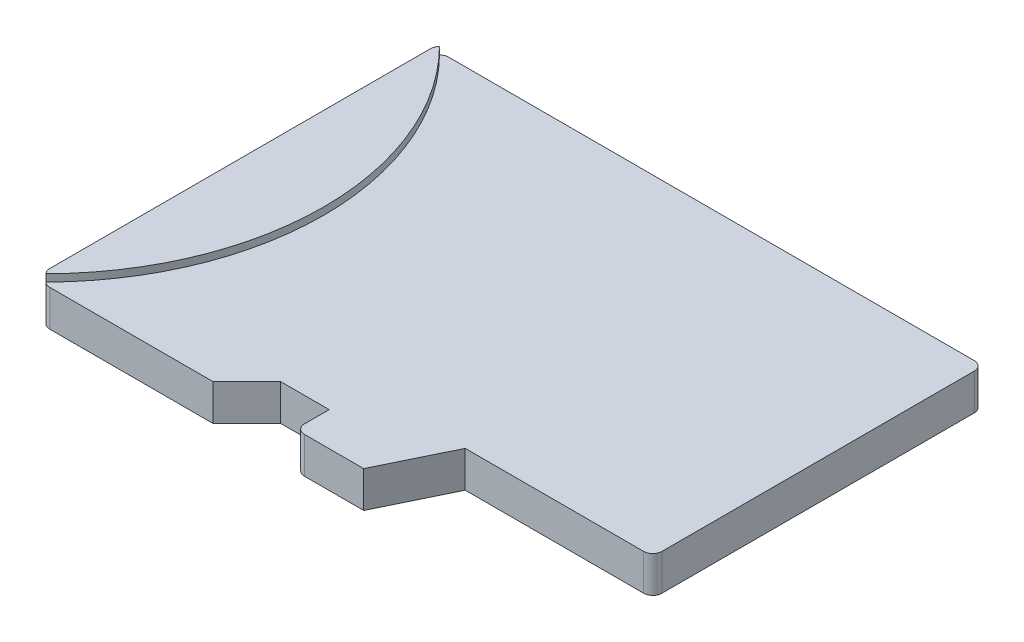
ISO-10303-21;
HEADER;
FILE_DESCRIPTION(('STEP AP214'),'2;1');
FILE_NAME('part.step','',(''),(''),'','','');
FILE_SCHEMA(('AUTOMOTIVE_DESIGN { 1 0 10303 214 1 1 1 1 }'));
ENDSEC;
DATA;
#1=APPLICATION_CONTEXT('core data for automotive mechanical design processes');
#2=APPLICATION_PROTOCOL_DEFINITION('international standard','automotive_design',2000,#1);
#3=PRODUCT_CONTEXT('',#1,'mechanical');
#4=PRODUCT('Part','Part','',(#3));
#5=PRODUCT_RELATED_PRODUCT_CATEGORY('part','',(#4));
#6=PRODUCT_DEFINITION_FORMATION('','',#4);
#7=PRODUCT_DEFINITION_CONTEXT('part definition',#1,'design');
#8=PRODUCT_DEFINITION('design','',#6,#7);
#9=PRODUCT_DEFINITION_SHAPE('','',#8);
#10=(LENGTH_UNIT() NAMED_UNIT(*) SI_UNIT(.MILLI.,.METRE.));
#11=(NAMED_UNIT(*) PLANE_ANGLE_UNIT() SI_UNIT($,.RADIAN.));
#12=(NAMED_UNIT(*) SI_UNIT($,.STERADIAN.) SOLID_ANGLE_UNIT());
#13=UNCERTAINTY_MEASURE_WITH_UNIT(LENGTH_MEASURE(1.E-05),#10,'distance_accuracy_value','');
#14=(GEOMETRIC_REPRESENTATION_CONTEXT(3) GLOBAL_UNCERTAINTY_ASSIGNED_CONTEXT((#13)) GLOBAL_UNIT_ASSIGNED_CONTEXT((#10,
#11,#12)) REPRESENTATION_CONTEXT('',''));
#15=CARTESIAN_POINT('',(0.,0.,0.));
#16=DIRECTION('',(0.,0.,1.));
#17=DIRECTION('',(1.,0.,0.));
#18=AXIS2_PLACEMENT_3D('',#15,#16,#17);
#19=CARTESIAN_POINT('',(0.,1.,0.));
#20=DIRECTION('',(0.,0.,-1.));
#21=DIRECTION('',(-1.,0.,0.));
#22=AXIS2_PLACEMENT_3D('',#19,#20,#21);
#23=PLANE('',#22);
#24=DIRECTION('',(1.,0.,0.));
#25=VECTOR('',#24,1.);
#26=CARTESIAN_POINT('',(0.,1.,0.));
#27=LINE('',#26,#25);
#28=CARTESIAN_POINT('',(0.25,1.,0.));
#29=VERTEX_POINT('',#28);
#30=CARTESIAN_POINT('',(4.74943820224719,1.,0.));
#31=VERTEX_POINT('',#30);
#32=EDGE_CURVE('E236',#29,#31,#27,.T.);
#33=ORIENTED_EDGE('',*,*,#32,.F.);
#34=DIRECTION('',(0.,-1.,0.));
#35=VECTOR('',#34,1.);
#36=CARTESIAN_POINT('',(0.25,1.,0.));
#37=LINE('',#36,#35);
#38=CARTESIAN_POINT('',(0.25,0.,0.));
#39=VERTEX_POINT('',#38);
#40=EDGE_CURVE('E317',#29,#39,#37,.T.);
#41=ORIENTED_EDGE('',*,*,#40,.T.);
#42=DIRECTION('',(1.,0.,0.));
#43=VECTOR('',#42,1.);
#44=CARTESIAN_POINT('',(0.,0.,0.));
#45=LINE('',#44,#43);
#46=CARTESIAN_POINT('',(4.74943820224719,0.,0.));
#47=VERTEX_POINT('',#46);
#48=EDGE_CURVE('E170',#39,#47,#45,.T.);
#49=ORIENTED_EDGE('',*,*,#48,.T.);
#50=DIRECTION('',(0.,1.,0.));
#51=VECTOR('',#50,1.);
#52=CARTESIAN_POINT('',(4.74943820224719,0.,0.));
#53=LINE('',#52,#51);
#54=EDGE_CURVE('E226',#47,#31,#53,.T.);
#55=ORIENTED_EDGE('',*,*,#54,.T.);
#56=EDGE_LOOP('',(#33,#41,#49,#55));
#57=FACE_BOUND('',#56,.T.);
#58=ADVANCED_FACE('F39',(#57),#23,.F.);
#59=CARTESIAN_POINT('',(0.,1.,-11.));
#60=DIRECTION('',(1.,0.,0.));
#61=DIRECTION('',(0.,0.,-1.));
#62=AXIS2_PLACEMENT_3D('',#59,#60,#61);
#63=PLANE('',#62);
#64=DIRECTION('',(0.,0.,1.));
#65=VECTOR('',#64,1.);
#66=CARTESIAN_POINT('',(0.,0.,-11.));
#67=LINE('',#66,#65);
#68=CARTESIAN_POINT('',(0.,0.,-10.75));
#69=VERTEX_POINT('',#68);
#70=CARTESIAN_POINT('',(0.,0.,-0.25));
#71=VERTEX_POINT('',#70);
#72=EDGE_CURVE('E171',#69,#71,#67,.T.);
#73=ORIENTED_EDGE('',*,*,#72,.T.);
#74=DIRECTION('',(0.,-1.,0.));
#75=VECTOR('',#74,1.);
#76=CARTESIAN_POINT('',(0.,1.,-0.25));
#77=LINE('',#76,#75);
#78=CARTESIAN_POINT('',(0.,1.2,-0.25));
#79=VERTEX_POINT('',#78);
#80=EDGE_CURVE('E325',#71,#79,#77,.F.);
#81=ORIENTED_EDGE('',*,*,#80,.T.);
#82=DIRECTION('',(0.,0.,-1.));
#83=VECTOR('',#82,1.);
#84=CARTESIAN_POINT('',(0.,1.2,-5.5));
#85=LINE('',#84,#83);
#86=CARTESIAN_POINT('',(0.,1.2,-10.75));
#87=VERTEX_POINT('',#86);
#88=EDGE_CURVE('E285',#79,#87,#85,.T.);
#89=ORIENTED_EDGE('',*,*,#88,.T.);
#90=DIRECTION('',(0.,-1.,0.));
#91=VECTOR('',#90,1.);
#92=CARTESIAN_POINT('',(0.,1.,-10.75));
#93=LINE('',#92,#91);
#94=EDGE_CURVE('E321',#87,#69,#93,.T.);
#95=ORIENTED_EDGE('',*,*,#94,.T.);
#96=EDGE_LOOP('',(#73,#81,#89,#95));
#97=FACE_BOUND('',#96,.T.);
#98=ADVANCED_FACE('F362',(#97),#63,.F.);
#99=CARTESIAN_POINT('',(7.27459425717853,1.,0.));
#100=VERTEX_POINT('',#99);
#101=CARTESIAN_POINT('',(8.90923845193508,1.,0.));
#102=VERTEX_POINT('',#101);
#103=EDGE_CURVE('E240',#100,#102,#27,.T.);
#104=ORIENTED_EDGE('',*,*,#103,.F.);
#105=DIRECTION('',(0.,1.,0.));
#106=VECTOR('',#105,1.);
#107=CARTESIAN_POINT('',(7.27459425717853,1.,0.));
#108=LINE('',#107,#106);
#109=CARTESIAN_POINT('',(7.27459425717853,0.,0.));
#110=VERTEX_POINT('',#109);
#111=EDGE_CURVE('E165',#100,#110,#108,.F.);
#112=ORIENTED_EDGE('',*,*,#111,.T.);
#113=CARTESIAN_POINT('',(8.90923845193508,0.,0.));
#114=VERTEX_POINT('',#113);
#115=EDGE_CURVE('E159',#110,#114,#45,.T.);
#116=ORIENTED_EDGE('',*,*,#115,.T.);
#117=DIRECTION('',(0.,1.,0.));
#118=VECTOR('',#117,1.);
#119=CARTESIAN_POINT('',(8.90923845193508,0.,0.));
#120=LINE('',#119,#118);
#121=EDGE_CURVE('E163',#114,#102,#120,.T.);
#122=ORIENTED_EDGE('',*,*,#121,.T.);
#123=EDGE_LOOP('',(#104,#112,#116,#122));
#124=FACE_BOUND('',#123,.T.);
#125=ADVANCED_FACE('F162',(#124),#23,.F.);
#126=CARTESIAN_POINT('',(15.,1.,-11.));
#127=DIRECTION('',(-1.,0.,0.));
#128=DIRECTION('',(0.,0.,1.));
#129=AXIS2_PLACEMENT_3D('',#126,#127,#128);
#130=PLANE('',#129);
#131=DIRECTION('',(0.,0.,-1.));
#132=VECTOR('',#131,1.);
#133=CARTESIAN_POINT('',(15.,0.,-11.));
#134=LINE('',#133,#132);
#135=CARTESIAN_POINT('',(15.,0.,-2.13352059925094));
#136=VERTEX_POINT('',#135);
#137=CARTESIAN_POINT('',(15.,0.,-10.75));
#138=VERTEX_POINT('',#137);
#139=EDGE_CURVE('E253',#136,#138,#134,.T.);
#140=ORIENTED_EDGE('',*,*,#139,.T.);
#141=DIRECTION('',(0.,-1.,0.));
#142=VECTOR('',#141,1.);
#143=CARTESIAN_POINT('',(15.,1.,-10.75));
#144=LINE('',#143,#142);
#145=CARTESIAN_POINT('',(15.,1.,-10.75));
#146=VERTEX_POINT('',#145);
#147=EDGE_CURVE('E305',#138,#146,#144,.F.);
#148=ORIENTED_EDGE('',*,*,#147,.T.);
#149=DIRECTION('',(0.,0.,-1.));
#150=VECTOR('',#149,1.);
#151=CARTESIAN_POINT('',(15.,1.,-11.));
#152=LINE('',#151,#150);
#153=CARTESIAN_POINT('',(15.,1.,-2.13352059925094));
#154=VERTEX_POINT('',#153);
#155=EDGE_CURVE('E239',#154,#146,#152,.T.);
#156=ORIENTED_EDGE('',*,*,#155,.F.);
#157=DIRECTION('',(0.,1.,0.));
#158=VECTOR('',#157,1.);
#159=CARTESIAN_POINT('',(15.,1.,-2.13352059925094));
#160=LINE('',#159,#158);
#161=EDGE_CURVE('E267',#154,#136,#160,.F.);
#162=ORIENTED_EDGE('',*,*,#161,.T.);
#163=EDGE_LOOP('',(#140,#148,#156,#162));
#164=FACE_BOUND('',#163,.T.);
#165=ADVANCED_FACE('F389',(#164),#130,.F.);
#166=CARTESIAN_POINT('',(0.,1.,-11.));
#167=DIRECTION('',(0.,0.,1.));
#168=DIRECTION('',(1.,0.,0.));
#169=AXIS2_PLACEMENT_3D('',#166,#167,#168);
#170=PLANE('',#169);
#171=DIRECTION('',(-1.,0.,0.));
#172=VECTOR('',#171,1.);
#173=CARTESIAN_POINT('',(0.,1.,-11.));
#174=LINE('',#173,#172);
#175=CARTESIAN_POINT('',(14.75,1.,-11.));
#176=VERTEX_POINT('',#175);
#177=CARTESIAN_POINT('',(0.25,1.,-11.));
#178=VERTEX_POINT('',#177);
#179=EDGE_CURVE('E244',#176,#178,#174,.T.);
#180=ORIENTED_EDGE('',*,*,#179,.F.);
#181=DIRECTION('',(0.,-1.,0.));
#182=VECTOR('',#181,1.);
#183=CARTESIAN_POINT('',(14.75,1.,-11.));
#184=LINE('',#183,#182);
#185=CARTESIAN_POINT('',(14.75,0.,-11.));
#186=VERTEX_POINT('',#185);
#187=EDGE_CURVE('E292',#176,#186,#184,.T.);
#188=ORIENTED_EDGE('',*,*,#187,.T.);
#189=DIRECTION('',(-1.,0.,0.));
#190=VECTOR('',#189,1.);
#191=CARTESIAN_POINT('',(0.,0.,-11.));
#192=LINE('',#191,#190);
#193=CARTESIAN_POINT('',(0.25,0.,-11.));
#194=VERTEX_POINT('',#193);
#195=EDGE_CURVE('E257',#186,#194,#192,.T.);
#196=ORIENTED_EDGE('',*,*,#195,.T.);
#197=DIRECTION('',(0.,-1.,0.));
#198=VECTOR('',#197,1.);
#199=CARTESIAN_POINT('',(0.25,1.,-11.));
#200=LINE('',#199,#198);
#201=EDGE_CURVE('E289',#194,#178,#200,.F.);
#202=ORIENTED_EDGE('',*,*,#201,.T.);
#203=EDGE_LOOP('',(#180,#188,#196,#202));
#204=FACE_BOUND('',#203,.T.);
#205=ADVANCED_FACE('F380',(#204),#170,.F.);
#206=CARTESIAN_POINT('',(0.,1.,0.));
#207=DIRECTION('',(0.,1.,0.));
#208=DIRECTION('',(0.,0.,1.));
#209=AXIS2_PLACEMENT_3D('',#206,#207,#208);
#210=PLANE('',#209);
#211=ORIENTED_EDGE('',*,*,#155,.T.);
#212=CARTESIAN_POINT('',(14.75,1.,-10.75));
#213=DIRECTION('',(0.,1.,0.));
#214=DIRECTION('',(0.,0.,1.));
#215=AXIS2_PLACEMENT_3D('',#212,#213,#214);
#216=CIRCLE('',#215,0.25);
#217=EDGE_CURVE('E314',#146,#176,#216,.T.);
#218=ORIENTED_EDGE('',*,*,#217,.T.);
#219=ORIENTED_EDGE('',*,*,#179,.T.);
#220=CARTESIAN_POINT('',(0.25,1.,-10.75));
#221=DIRECTION('',(0.,1.,0.));
#222=DIRECTION('',(0.,0.,1.));
#223=AXIS2_PLACEMENT_3D('',#220,#221,#222);
#224=CIRCLE('',#223,0.25);
#225=CARTESIAN_POINT('',(0.0730404811801677,1.,-10.9265936825004));
#226=VERTEX_POINT('',#225);
#227=EDGE_CURVE('E308',#178,#226,#224,.T.);
#228=ORIENTED_EDGE('',*,*,#227,.T.);
#229=CARTESIAN_POINT('',(-5.39679553144825,1.,-5.5));
#230=DIRECTION('',(0.,1.,0.));
#231=DIRECTION('',(0.,0.,1.));
#232=AXIS2_PLACEMENT_3D('',#229,#230,#231);
#233=CIRCLE('',#232,7.705);
#234=CARTESIAN_POINT('',(0.0730404811801633,1.,-0.0734063174995933));
#235=VERTEX_POINT('',#234);
#236=EDGE_CURVE('E369',#235,#226,#233,.T.);
#237=ORIENTED_EDGE('',*,*,#236,.F.);
#238=CARTESIAN_POINT('',(0.25,1.,-0.25));
#239=DIRECTION('',(0.,1.,0.));
#240=DIRECTION('',(0.,0.,1.));
#241=AXIS2_PLACEMENT_3D('',#238,#239,#240);
#242=CIRCLE('',#241,0.25);
#243=EDGE_CURVE('E311',#235,#29,#242,.T.);
#244=ORIENTED_EDGE('',*,*,#243,.T.);
#245=ORIENTED_EDGE('',*,*,#32,.T.);
#246=DIRECTION('',(-0.707106781186546,0.,0.707106781186549));
#247=VECTOR('',#246,1.);
#248=CARTESIAN_POINT('',(4.74943820224719,1.,0.));
#249=LINE('',#248,#247);
#250=CARTESIAN_POINT('',(5.68270911360799,1.,-0.933270911360803));
#251=VERTEX_POINT('',#250);
#252=EDGE_CURVE('E208',#251,#31,#249,.T.);
#253=ORIENTED_EDGE('',*,*,#252,.F.);
#254=DIRECTION('',(-1.,0.,0.));
#255=VECTOR('',#254,1.);
#256=CARTESIAN_POINT('',(5.68270911360799,1.,-0.933270911360803));
#257=LINE('',#256,#255);
#258=CARTESIAN_POINT('',(7.02459425717853,1.,-0.933270911360803));
#259=VERTEX_POINT('',#258);
#260=EDGE_CURVE('E219',#259,#251,#257,.T.);
#261=ORIENTED_EDGE('',*,*,#260,.F.);
#262=DIRECTION('',(0.,0.,-1.));
#263=VECTOR('',#262,1.);
#264=CARTESIAN_POINT('',(7.02459425717853,1.,-0.933270911360803));
#265=LINE('',#264,#263);
#266=CARTESIAN_POINT('',(7.02459425717853,1.,-0.25));
#267=VERTEX_POINT('',#266);
#268=EDGE_CURVE('E183',#267,#259,#265,.T.);
#269=ORIENTED_EDGE('',*,*,#268,.F.);
#270=CARTESIAN_POINT('',(7.27459425717853,1.,-0.25));
#271=DIRECTION('',(0.,1.,0.));
#272=DIRECTION('',(0.,0.,1.));
#273=AXIS2_PLACEMENT_3D('',#270,#271,#272);
#274=CIRCLE('',#273,0.25);
#275=EDGE_CURVE('E277',#267,#100,#274,.T.);
#276=ORIENTED_EDGE('',*,*,#275,.T.);
#277=ORIENTED_EDGE('',*,*,#103,.T.);
#278=DIRECTION('',(-0.437676705878572,0.,0.899132415793849));
#279=VECTOR('',#278,1.);
#280=CARTESIAN_POINT('',(8.90923845193508,1.,0.));
#281=LINE('',#280,#279);
#282=CARTESIAN_POINT('',(9.82609238451935,1.,-1.88352059925094));
#283=VERTEX_POINT('',#282);
#284=EDGE_CURVE('E181',#283,#102,#281,.T.);
#285=ORIENTED_EDGE('',*,*,#284,.F.);
#286=DIRECTION('',(-1.,0.,0.));
#287=VECTOR('',#286,1.);
#288=CARTESIAN_POINT('',(9.82609238451935,1.,-1.88352059925094));
#289=LINE('',#288,#287);
#290=CARTESIAN_POINT('',(14.75,1.,-1.88352059925094));
#291=VERTEX_POINT('',#290);
#292=EDGE_CURVE('E198',#291,#283,#289,.T.);
#293=ORIENTED_EDGE('',*,*,#292,.F.);
#294=CARTESIAN_POINT('',(14.75,1.,-2.13352059925094));
#295=DIRECTION('',(0.,1.,0.));
#296=DIRECTION('',(0.,0.,1.));
#297=AXIS2_PLACEMENT_3D('',#294,#295,#296);
#298=CIRCLE('',#297,0.25);
#299=EDGE_CURVE('E264',#291,#154,#298,.T.);
#300=ORIENTED_EDGE('',*,*,#299,.T.);
#301=EDGE_LOOP('',(#211,#218,#219,#228,#237,#244,#245,#253,#261,#269,#276,#277,#285,#293,#300));
#302=FACE_BOUND('',#301,.T.);
#303=ADVANCED_FACE('F335',(#302),#210,.T.);
#304=CARTESIAN_POINT('',(0.,0.,0.));
#305=DIRECTION('',(0.,1.,0.));
#306=DIRECTION('',(0.,0.,1.));
#307=AXIS2_PLACEMENT_3D('',#304,#305,#306);
#308=PLANE('',#307);
#309=ORIENTED_EDGE('',*,*,#195,.F.);
#310=CARTESIAN_POINT('',(14.75,0.,-10.75));
#311=DIRECTION('',(0.,1.,0.));
#312=DIRECTION('',(0.,0.,1.));
#313=AXIS2_PLACEMENT_3D('',#310,#311,#312);
#314=CIRCLE('',#313,0.25);
#315=EDGE_CURVE('E302',#186,#138,#314,.F.);
#316=ORIENTED_EDGE('',*,*,#315,.T.);
#317=ORIENTED_EDGE('',*,*,#139,.F.);
#318=CARTESIAN_POINT('',(14.75,0.,-2.13352059925094));
#319=DIRECTION('',(0.,1.,0.));
#320=DIRECTION('',(0.,0.,1.));
#321=AXIS2_PLACEMENT_3D('',#318,#319,#320);
#322=CIRCLE('',#321,0.25);
#323=CARTESIAN_POINT('',(14.75,0.,-1.88352059925094));
#324=VERTEX_POINT('',#323);
#325=EDGE_CURVE('E270',#136,#324,#322,.F.);
#326=ORIENTED_EDGE('',*,*,#325,.T.);
#327=DIRECTION('',(-1.,0.,0.));
#328=VECTOR('',#327,1.);
#329=CARTESIAN_POINT('',(9.82609238451935,0.,-1.88352059925094));
#330=LINE('',#329,#328);
#331=CARTESIAN_POINT('',(9.82609238451935,0.,-1.88352059925094));
#332=VERTEX_POINT('',#331);
#333=EDGE_CURVE('E189',#324,#332,#330,.T.);
#334=ORIENTED_EDGE('',*,*,#333,.T.);
#335=DIRECTION('',(-0.437676705878572,0.,0.899132415793849));
#336=VECTOR('',#335,1.);
#337=CARTESIAN_POINT('',(8.90923845193508,0.,0.));
#338=LINE('',#337,#336);
#339=EDGE_CURVE('E178',#332,#114,#338,.T.);
#340=ORIENTED_EDGE('',*,*,#339,.T.);
#341=ORIENTED_EDGE('',*,*,#115,.F.);
#342=CARTESIAN_POINT('',(7.27459425717853,0.,-0.25));
#343=DIRECTION('',(0.,1.,0.));
#344=DIRECTION('',(0.,0.,1.));
#345=AXIS2_PLACEMENT_3D('',#342,#343,#344);
#346=CIRCLE('',#345,0.25);
#347=CARTESIAN_POINT('',(7.02459425717853,0.,-0.25));
#348=VERTEX_POINT('',#347);
#349=EDGE_CURVE('E282',#110,#348,#346,.F.);
#350=ORIENTED_EDGE('',*,*,#349,.T.);
#351=DIRECTION('',(0.,0.,-1.));
#352=VECTOR('',#351,1.);
#353=CARTESIAN_POINT('',(7.02459425717853,0.,-0.933270911360803));
#354=LINE('',#353,#352);
#355=CARTESIAN_POINT('',(7.02459425717853,0.,-0.933270911360803));
#356=VERTEX_POINT('',#355);
#357=EDGE_CURVE('E204',#348,#356,#354,.T.);
#358=ORIENTED_EDGE('',*,*,#357,.T.);
#359=DIRECTION('',(-1.,0.,0.));
#360=VECTOR('',#359,1.);
#361=CARTESIAN_POINT('',(5.68270911360799,0.,-0.933270911360803));
#362=LINE('',#361,#360);
#363=CARTESIAN_POINT('',(5.68270911360799,0.,-0.933270911360803));
#364=VERTEX_POINT('',#363);
#365=EDGE_CURVE('E207',#356,#364,#362,.T.);
#366=ORIENTED_EDGE('',*,*,#365,.T.);
#367=DIRECTION('',(-0.707106781186546,0.,0.707106781186549));
#368=VECTOR('',#367,1.);
#369=CARTESIAN_POINT('',(4.74943820224719,0.,0.));
#370=LINE('',#369,#368);
#371=EDGE_CURVE('E212',#364,#47,#370,.T.);
#372=ORIENTED_EDGE('',*,*,#371,.T.);
#373=ORIENTED_EDGE('',*,*,#48,.F.);
#374=CARTESIAN_POINT('',(0.25,0.,-0.25));
#375=DIRECTION('',(0.,1.,0.));
#376=DIRECTION('',(0.,0.,1.));
#377=AXIS2_PLACEMENT_3D('',#374,#375,#376);
#378=CIRCLE('',#377,0.25);
#379=EDGE_CURVE('E299',#39,#71,#378,.F.);
#380=ORIENTED_EDGE('',*,*,#379,.T.);
#381=ORIENTED_EDGE('',*,*,#72,.F.);
#382=CARTESIAN_POINT('',(0.25,0.,-10.75));
#383=DIRECTION('',(0.,1.,0.));
#384=DIRECTION('',(0.,0.,1.));
#385=AXIS2_PLACEMENT_3D('',#382,#383,#384);
#386=CIRCLE('',#385,0.25);
#387=EDGE_CURVE('E296',#69,#194,#386,.F.);
#388=ORIENTED_EDGE('',*,*,#387,.T.);
#389=EDGE_LOOP('',(#309,#316,#317,#326,#334,#340,#341,#350,#358,#366,#372,#373,#380,#381,#388));
#390=FACE_BOUND('',#389,.T.);
#391=ADVANCED_FACE('F187',(#390),#308,.F.);
#392=CARTESIAN_POINT('',(4.74943820224719,0.,0.));
#393=DIRECTION('',(-0.707106781186549,0.,-0.707106781186546));
#394=DIRECTION('',(-0.707106781186546,0.,0.707106781186549));
#395=AXIS2_PLACEMENT_3D('',#392,#393,#394);
#396=PLANE('',#395);
#397=ORIENTED_EDGE('',*,*,#252,.T.);
#398=ORIENTED_EDGE('',*,*,#54,.F.);
#399=ORIENTED_EDGE('',*,*,#371,.F.);
#400=DIRECTION('',(0.,1.,0.));
#401=VECTOR('',#400,1.);
#402=CARTESIAN_POINT('',(5.68270911360799,0.,-0.933270911360803));
#403=LINE('',#402,#401);
#404=EDGE_CURVE('E230',#364,#251,#403,.T.);
#405=ORIENTED_EDGE('',*,*,#404,.T.);
#406=EDGE_LOOP('',(#397,#398,#399,#405));
#407=FACE_BOUND('',#406,.T.);
#408=ADVANCED_FACE('F353',(#407),#396,.F.);
#409=CARTESIAN_POINT('',(5.68270911360799,0.,-0.933270911360803));
#410=DIRECTION('',(0.,0.,-1.));
#411=DIRECTION('',(-1.,0.,0.));
#412=AXIS2_PLACEMENT_3D('',#409,#410,#411);
#413=PLANE('',#412);
#414=ORIENTED_EDGE('',*,*,#260,.T.);
#415=ORIENTED_EDGE('',*,*,#404,.F.);
#416=ORIENTED_EDGE('',*,*,#365,.F.);
#417=DIRECTION('',(0.,1.,0.));
#418=VECTOR('',#417,1.);
#419=CARTESIAN_POINT('',(7.02459425717853,0.,-0.933270911360803));
#420=LINE('',#419,#418);
#421=EDGE_CURVE('E216',#356,#259,#420,.T.);
#422=ORIENTED_EDGE('',*,*,#421,.T.);
#423=EDGE_LOOP('',(#414,#415,#416,#422));
#424=FACE_BOUND('',#423,.T.);
#425=ADVANCED_FACE('F348',(#424),#413,.F.);
#426=CARTESIAN_POINT('',(7.02459425717853,0.,-0.933270911360803));
#427=DIRECTION('',(1.,0.,0.));
#428=DIRECTION('',(0.,0.,-1.));
#429=AXIS2_PLACEMENT_3D('',#426,#427,#428);
#430=PLANE('',#429);
#431=ORIENTED_EDGE('',*,*,#357,.F.);
#432=DIRECTION('',(0.,1.,0.));
#433=VECTOR('',#432,1.);
#434=CARTESIAN_POINT('',(7.02459425717853,0.,-0.25));
#435=LINE('',#434,#433);
#436=EDGE_CURVE('E273',#348,#267,#435,.T.);
#437=ORIENTED_EDGE('',*,*,#436,.T.);
#438=ORIENTED_EDGE('',*,*,#268,.T.);
#439=ORIENTED_EDGE('',*,*,#421,.F.);
#440=EDGE_LOOP('',(#431,#437,#438,#439));
#441=FACE_BOUND('',#440,.T.);
#442=ADVANCED_FACE('F345',(#441),#430,.F.);
#443=CARTESIAN_POINT('',(8.90923845193508,0.,0.));
#444=DIRECTION('',(-0.899132415793849,0.,-0.437676705878572));
#445=DIRECTION('',(-0.437676705878572,0.,0.899132415793849));
#446=AXIS2_PLACEMENT_3D('',#443,#444,#445);
#447=PLANE('',#446);
#448=ORIENTED_EDGE('',*,*,#284,.T.);
#449=ORIENTED_EDGE('',*,*,#121,.F.);
#450=ORIENTED_EDGE('',*,*,#339,.F.);
#451=DIRECTION('',(0.,1.,0.));
#452=VECTOR('',#451,1.);
#453=CARTESIAN_POINT('',(9.82609238451935,0.,-1.88352059925094));
#454=LINE('',#453,#452);
#455=EDGE_CURVE('E184',#332,#283,#454,.T.);
#456=ORIENTED_EDGE('',*,*,#455,.T.);
#457=EDGE_LOOP('',(#448,#449,#450,#456));
#458=FACE_BOUND('',#457,.T.);
#459=ADVANCED_FACE('F176',(#458),#447,.F.);
#460=CARTESIAN_POINT('',(9.82609238451935,0.,-1.88352059925094));
#461=DIRECTION('',(0.,0.,-1.));
#462=DIRECTION('',(-1.,0.,0.));
#463=AXIS2_PLACEMENT_3D('',#460,#461,#462);
#464=PLANE('',#463);
#465=ORIENTED_EDGE('',*,*,#333,.F.);
#466=DIRECTION('',(0.,1.,0.));
#467=VECTOR('',#466,1.);
#468=CARTESIAN_POINT('',(14.75,0.,-1.88352059925094));
#469=LINE('',#468,#467);
#470=EDGE_CURVE('E248',#324,#291,#469,.T.);
#471=ORIENTED_EDGE('',*,*,#470,.T.);
#472=ORIENTED_EDGE('',*,*,#292,.T.);
#473=ORIENTED_EDGE('',*,*,#455,.F.);
#474=EDGE_LOOP('',(#465,#471,#472,#473));
#475=FACE_BOUND('',#474,.T.);
#476=ADVANCED_FACE('F396',(#475),#464,.F.);
#477=CARTESIAN_POINT('',(14.75,0.,-2.13352059925094));
#478=DIRECTION('',(0.,1.,0.));
#479=DIRECTION('',(0.,0.,1.));
#480=AXIS2_PLACEMENT_3D('',#477,#478,#479);
#481=CYLINDRICAL_SURFACE('',#480,0.25);
#482=ORIENTED_EDGE('',*,*,#325,.F.);
#483=ORIENTED_EDGE('',*,*,#161,.F.);
#484=ORIENTED_EDGE('',*,*,#299,.F.);
#485=ORIENTED_EDGE('',*,*,#470,.F.);
#486=EDGE_LOOP('',(#482,#483,#484,#485));
#487=FACE_BOUND('',#486,.T.);
#488=ADVANCED_FACE('F393',(#487),#481,.T.);
#489=CARTESIAN_POINT('',(7.27459425717853,0.,-0.25));
#490=DIRECTION('',(0.,1.,0.));
#491=DIRECTION('',(0.,0.,1.));
#492=AXIS2_PLACEMENT_3D('',#489,#490,#491);
#493=CYLINDRICAL_SURFACE('',#492,0.25);
#494=ORIENTED_EDGE('',*,*,#349,.F.);
#495=ORIENTED_EDGE('',*,*,#111,.F.);
#496=ORIENTED_EDGE('',*,*,#275,.F.);
#497=ORIENTED_EDGE('',*,*,#436,.F.);
#498=EDGE_LOOP('',(#494,#495,#496,#497));
#499=FACE_BOUND('',#498,.T.);
#500=ADVANCED_FACE('F339',(#499),#493,.T.);
#501=CARTESIAN_POINT('',(-5.39679553144825,1.2,-5.5));
#502=DIRECTION('',(0.,-1.,0.));
#503=DIRECTION('',(0.,0.,-1.));
#504=AXIS2_PLACEMENT_3D('',#501,#502,#503);
#505=CYLINDRICAL_SURFACE('',#504,7.705);
#506=CARTESIAN_POINT('',(-5.39679553144825,1.2,-5.5));
#507=DIRECTION('',(0.,1.,0.));
#508=DIRECTION('',(0.,0.,1.));
#509=AXIS2_PLACEMENT_3D('',#506,#507,#508);
#510=CIRCLE('',#509,7.705);
#511=CARTESIAN_POINT('',(0.0730404811801668,1.2,-0.0734063174995968));
#512=VERTEX_POINT('',#511);
#513=CARTESIAN_POINT('',(0.0730404811801633,1.2,-10.9265936825004));
#514=VERTEX_POINT('',#513);
#515=EDGE_CURVE('E201',#512,#514,#510,.T.);
#516=ORIENTED_EDGE('',*,*,#515,.F.);
#517=DIRECTION('',(0.,-1.,0.));
#518=VECTOR('',#517,1.);
#519=CARTESIAN_POINT('',(0.0730404811801668,1.2,-0.0734063174995968));
#520=LINE('',#519,#518);
#521=EDGE_CURVE('E11',#512,#235,#520,.T.);
#522=ORIENTED_EDGE('',*,*,#521,.T.);
#523=ORIENTED_EDGE('',*,*,#236,.T.);
#524=DIRECTION('',(0.,-1.,0.));
#525=VECTOR('',#524,1.);
#526=CARTESIAN_POINT('',(0.0730404811801677,1.,-10.9265936825004));
#527=LINE('',#526,#525);
#528=EDGE_CURVE('E48',#226,#514,#527,.F.);
#529=ORIENTED_EDGE('',*,*,#528,.T.);
#530=EDGE_LOOP('',(#516,#522,#523,#529));
#531=FACE_BOUND('',#530,.T.);
#532=ADVANCED_FACE('F368',(#531),#505,.T.);
#533=CARTESIAN_POINT('',(-5.39679553144825,1.2,-5.5));
#534=DIRECTION('',(0.,1.,0.));
#535=DIRECTION('',(0.,0.,1.));
#536=AXIS2_PLACEMENT_3D('',#533,#534,#535);
#537=PLANE('',#536);
#538=ORIENTED_EDGE('',*,*,#88,.F.);
#539=CARTESIAN_POINT('',(0.25,1.2,-0.25));
#540=DIRECTION('',(0.,1.,0.));
#541=DIRECTION('',(0.,0.,1.));
#542=AXIS2_PLACEMENT_3D('',#539,#540,#541);
#543=CIRCLE('',#542,0.25);
#544=EDGE_CURVE('E61',#79,#512,#543,.T.);
#545=ORIENTED_EDGE('',*,*,#544,.T.);
#546=ORIENTED_EDGE('',*,*,#515,.T.);
#547=CARTESIAN_POINT('',(0.25,1.2,-10.75));
#548=DIRECTION('',(0.,1.,0.));
#549=DIRECTION('',(0.,0.,1.));
#550=AXIS2_PLACEMENT_3D('',#547,#548,#549);
#551=CIRCLE('',#550,0.25);
#552=EDGE_CURVE('E328',#514,#87,#551,.T.);
#553=ORIENTED_EDGE('',*,*,#552,.T.);
#554=EDGE_LOOP('',(#538,#545,#546,#553));
#555=FACE_BOUND('',#554,.T.);
#556=ADVANCED_FACE('F375',(#555),#537,.T.);
#557=CARTESIAN_POINT('',(14.75,1.,-10.75));
#558=DIRECTION('',(0.,-1.,0.));
#559=DIRECTION('',(0.,0.,-1.));
#560=AXIS2_PLACEMENT_3D('',#557,#558,#559);
#561=CYLINDRICAL_SURFACE('',#560,0.25);
#562=ORIENTED_EDGE('',*,*,#217,.F.);
#563=ORIENTED_EDGE('',*,*,#147,.F.);
#564=ORIENTED_EDGE('',*,*,#315,.F.);
#565=ORIENTED_EDGE('',*,*,#187,.F.);
#566=EDGE_LOOP('',(#562,#563,#564,#565));
#567=FACE_BOUND('',#566,.T.);
#568=ADVANCED_FACE('F384',(#567),#561,.T.);
#569=CARTESIAN_POINT('',(0.25,1.,-0.25));
#570=DIRECTION('',(0.,-1.,0.));
#571=DIRECTION('',(0.,0.,-1.));
#572=AXIS2_PLACEMENT_3D('',#569,#570,#571);
#573=CYLINDRICAL_SURFACE('',#572,0.25);
#574=ORIENTED_EDGE('',*,*,#544,.F.);
#575=ORIENTED_EDGE('',*,*,#80,.F.);
#576=ORIENTED_EDGE('',*,*,#379,.F.);
#577=ORIENTED_EDGE('',*,*,#40,.F.);
#578=ORIENTED_EDGE('',*,*,#243,.F.);
#579=ORIENTED_EDGE('',*,*,#521,.F.);
#580=EDGE_LOOP('',(#574,#575,#576,#577,#578,#579));
#581=FACE_BOUND('',#580,.T.);
#582=ADVANCED_FACE('F364',(#581),#573,.T.);
#583=CARTESIAN_POINT('',(0.25,1.,-10.75));
#584=DIRECTION('',(0.,-1.,0.));
#585=DIRECTION('',(0.,0.,-1.));
#586=AXIS2_PLACEMENT_3D('',#583,#584,#585);
#587=CYLINDRICAL_SURFACE('',#586,0.25);
#588=ORIENTED_EDGE('',*,*,#227,.F.);
#589=ORIENTED_EDGE('',*,*,#201,.F.);
#590=ORIENTED_EDGE('',*,*,#387,.F.);
#591=ORIENTED_EDGE('',*,*,#94,.F.);
#592=ORIENTED_EDGE('',*,*,#552,.F.);
#593=ORIENTED_EDGE('',*,*,#528,.F.);
#594=EDGE_LOOP('',(#588,#589,#590,#591,#592,#593));
#595=FACE_BOUND('',#594,.T.);
#596=ADVANCED_FACE('F41',(#595),#587,.T.);
#597=CLOSED_SHELL('',(#58,#98,#125,#165,#205,#303,#391,#408,#425,#442,#459,#476,#488,#500,#532,
#556,#568,#582,#596));
#598=MANIFOLD_SOLID_BREP('B2',#597);
#599=ADVANCED_BREP_SHAPE_REPRESENTATION('',(#18,#598),#14);
#600=SHAPE_DEFINITION_REPRESENTATION(#9,#599);
ENDSEC;
END-ISO-10303-21;
